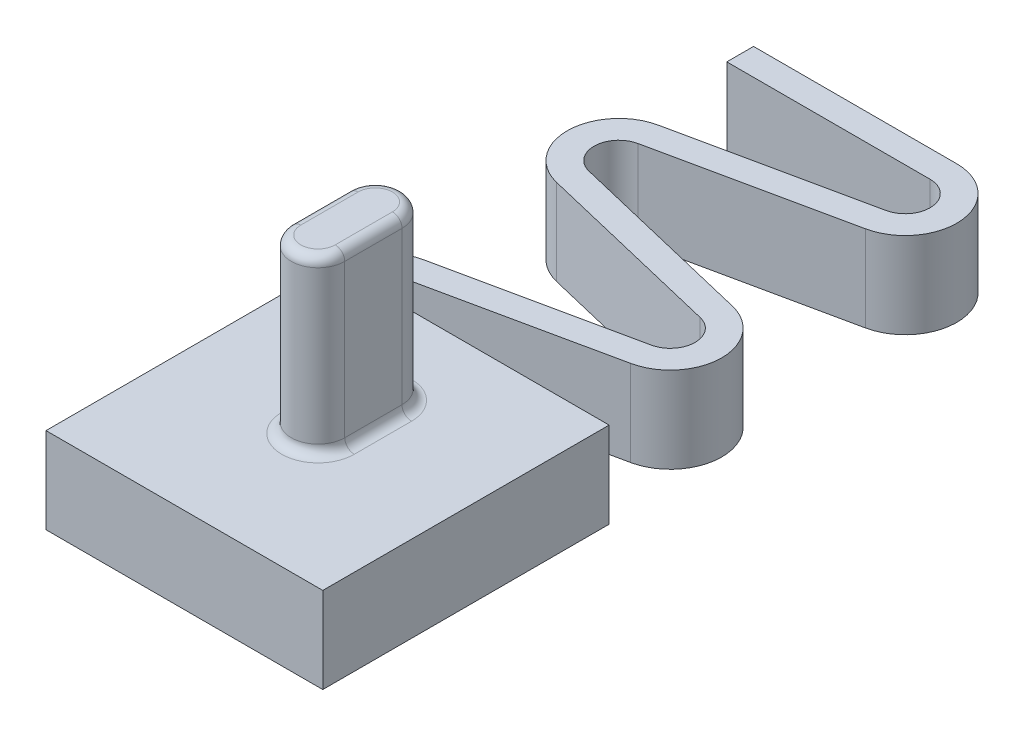
ISO-10303-21;
HEADER;
FILE_DESCRIPTION(('STEP AP214'),'2;1');
FILE_NAME('part.step','',(''),(''),'','','');
FILE_SCHEMA(('AUTOMOTIVE_DESIGN { 1 0 10303 214 1 1 1 1 }'));
ENDSEC;
DATA;
#1=APPLICATION_CONTEXT('core data for automotive mechanical design processes');
#2=APPLICATION_PROTOCOL_DEFINITION('international standard','automotive_design',2000,#1);
#3=PRODUCT_CONTEXT('',#1,'mechanical');
#4=PRODUCT('Part','Part','',(#3));
#5=PRODUCT_RELATED_PRODUCT_CATEGORY('part','',(#4));
#6=PRODUCT_DEFINITION_FORMATION('','',#4);
#7=PRODUCT_DEFINITION_CONTEXT('part definition',#1,'design');
#8=PRODUCT_DEFINITION('design','',#6,#7);
#9=PRODUCT_DEFINITION_SHAPE('','',#8);
#10=(LENGTH_UNIT() NAMED_UNIT(*) SI_UNIT(.MILLI.,.METRE.));
#11=(NAMED_UNIT(*) PLANE_ANGLE_UNIT() SI_UNIT($,.RADIAN.));
#12=(NAMED_UNIT(*) SI_UNIT($,.STERADIAN.) SOLID_ANGLE_UNIT());
#13=UNCERTAINTY_MEASURE_WITH_UNIT(LENGTH_MEASURE(1.E-05),#10,'distance_accuracy_value','');
#14=(GEOMETRIC_REPRESENTATION_CONTEXT(3) GLOBAL_UNCERTAINTY_ASSIGNED_CONTEXT((#13)) GLOBAL_UNIT_ASSIGNED_CONTEXT((#10,
#11,#12)) REPRESENTATION_CONTEXT('',''));
#15=CARTESIAN_POINT('',(0.,0.,0.));
#16=DIRECTION('',(0.,0.,1.));
#17=DIRECTION('',(1.,0.,0.));
#18=AXIS2_PLACEMENT_3D('',#15,#16,#17);
#19=CARTESIAN_POINT('',(0.,4.5,0.));
#20=DIRECTION('',(0.,-1.,0.));
#21=DIRECTION('',(0.,0.,-1.));
#22=AXIS2_PLACEMENT_3D('',#19,#20,#21);
#23=PLANE('',#22);
#24=DIRECTION('',(0.,0.,-1.));
#25=VECTOR('',#24,1.);
#26=CARTESIAN_POINT('',(1.9,4.5,0.500000000000003));
#27=LINE('',#26,#25);
#28=CARTESIAN_POINT('',(1.9,4.5,-2.5));
#29=VERTEX_POINT('',#28);
#30=CARTESIAN_POINT('',(1.9,4.5,0.500000000000003));
#31=VERTEX_POINT('',#30);
#32=EDGE_CURVE('E462',#29,#31,#27,.F.);
#33=ORIENTED_EDGE('',*,*,#32,.T.);
#34=CARTESIAN_POINT('',(0.,4.5,0.500000000000003));
#35=DIRECTION('',(0.,-1.,0.));
#36=DIRECTION('',(0.,0.,-1.));
#37=AXIS2_PLACEMENT_3D('',#34,#35,#36);
#38=CIRCLE('',#37,1.9);
#39=CARTESIAN_POINT('',(-1.9,4.5,0.500000000000003));
#40=VERTEX_POINT('',#39);
#41=EDGE_CURVE('E470',#31,#40,#38,.T.);
#42=ORIENTED_EDGE('',*,*,#41,.T.);
#43=DIRECTION('',(0.,0.,1.));
#44=VECTOR('',#43,1.);
#45=CARTESIAN_POINT('',(-1.9,4.5,-2.5));
#46=LINE('',#45,#44);
#47=CARTESIAN_POINT('',(-1.9,4.5,-2.5));
#48=VERTEX_POINT('',#47);
#49=EDGE_CURVE('E76',#40,#48,#46,.F.);
#50=ORIENTED_EDGE('',*,*,#49,.T.);
#51=CARTESIAN_POINT('',(0.,4.5,-2.5));
#52=DIRECTION('',(0.,-1.,0.));
#53=DIRECTION('',(0.,0.,-1.));
#54=AXIS2_PLACEMENT_3D('',#51,#52,#53);
#55=CIRCLE('',#54,1.9);
#56=EDGE_CURVE('E465',#48,#29,#55,.T.);
#57=ORIENTED_EDGE('',*,*,#56,.T.);
#58=EDGE_LOOP('',(#33,#42,#50,#57));
#59=FACE_BOUND('',#58,.T.);
#60=DIRECTION('',(-1.,0.,0.));
#61=VECTOR('',#60,1.);
#62=CARTESIAN_POINT('',(7.25,4.5,-7.5));
#63=LINE('',#62,#61);
#64=CARTESIAN_POINT('',(7.25,4.5,-7.5));
#65=VERTEX_POINT('',#64);
#66=CARTESIAN_POINT('',(-5.85,4.5,-7.5));
#67=VERTEX_POINT('',#66);
#68=EDGE_CURVE('E399',#65,#67,#63,.T.);
#69=ORIENTED_EDGE('',*,*,#68,.T.);
#70=CARTESIAN_POINT('',(-4.55000000000001,4.5,-7.5));
#71=DIRECTION('',(0.,1.,0.));
#72=DIRECTION('',(1.,0.,0.));
#73=AXIS2_PLACEMENT_3D('',#70,#71,#72);
#74=CIRCLE('',#73,1.3);
#75=CARTESIAN_POINT('',(-4.82028519806308,4.5,-8.77159188095395));
#76=VERTEX_POINT('',#75);
#77=EDGE_CURVE('E561',#67,#76,#74,.F.);
#78=ORIENTED_EDGE('',*,*,#77,.T.);
#79=DIRECTION('',(0.978147600733807,0.,-0.207911690817753));
#80=VECTOR('',#79,1.);
#81=CARTESIAN_POINT('',(-4.82028519806308,4.5,-8.77159188095395));
#82=LINE('',#81,#80);
#83=CARTESIAN_POINT('',(5.01136156520792,4.5,-10.861372912509));
#84=VERTEX_POINT('',#83);
#85=EDGE_CURVE('E557',#76,#84,#82,.T.);
#86=ORIENTED_EDGE('',*,*,#85,.T.);
#87=CARTESIAN_POINT('',(4.44999999999999,4.5,-13.5023714344902));
#88=DIRECTION('',(0.,1.,0.));
#89=DIRECTION('',(1.,0.,0.));
#90=AXIS2_PLACEMENT_3D('',#87,#88,#89);
#91=CIRCLE('',#90,2.7);
#92=CARTESIAN_POINT('',(5.07886156520793,4.5,-16.1281157350276));
#93=VERTEX_POINT('',#92);
#94=EDGE_CURVE('E553',#84,#93,#91,.T.);
#95=ORIENTED_EDGE('',*,*,#94,.T.);
#96=DIRECTION('',(-0.972497889087896,0.,-0.232911690817755));
#97=VECTOR('',#96,1.);
#98=CARTESIAN_POINT('',(5.07886156520793,4.5,-16.1281157350276));
#99=LINE('',#98,#97);
#100=CARTESIAN_POINT('',(-4.80278519806308,4.5,-18.4947543483575));
#101=VERTEX_POINT('',#100);
#102=EDGE_CURVE('E549',#93,#101,#99,.T.);
#103=ORIENTED_EDGE('',*,*,#102,.T.);
#104=CARTESIAN_POINT('',(-4.5,4.5,-19.7590016041718));
#105=DIRECTION('',(0.,1.,0.));
#106=DIRECTION('',(1.,0.,0.));
#107=AXIS2_PLACEMENT_3D('',#104,#105,#106);
#108=CIRCLE('',#107,1.3);
#109=CARTESIAN_POINT('',(-4.77028519806308,4.5,-21.0305934851257));
#110=VERTEX_POINT('',#109);
#111=EDGE_CURVE('E545',#101,#110,#108,.F.);
#112=ORIENTED_EDGE('',*,*,#111,.T.);
#113=DIRECTION('',(0.978147600733807,0.,-0.207911690817753));
#114=VECTOR('',#113,1.);
#115=CARTESIAN_POINT('',(-4.77028519806308,4.5,-21.0305934851257));
#116=LINE('',#115,#114);
#117=CARTESIAN_POINT('',(5.06136156520793,4.5,-23.1203745166807));
#118=VERTEX_POINT('',#117);
#119=EDGE_CURVE('E541',#110,#118,#116,.T.);
#120=ORIENTED_EDGE('',*,*,#119,.T.);
#121=CARTESIAN_POINT('',(4.5,4.5,-25.761373038662));
#122=DIRECTION('',(0.,1.,0.));
#123=DIRECTION('',(1.,0.,0.));
#124=AXIS2_PLACEMENT_3D('',#121,#122,#123);
#125=CIRCLE('',#124,2.7);
#126=CARTESIAN_POINT('',(4.5,4.5,-28.461373038662));
#127=VERTEX_POINT('',#126);
#128=EDGE_CURVE('E307',#118,#127,#125,.T.);
#129=ORIENTED_EDGE('',*,*,#128,.T.);
#130=DIRECTION('',(-1.,0.,0.));
#131=VECTOR('',#130,1.);
#132=CARTESIAN_POINT('',(4.5,4.5,-28.461373038662));
#133=LINE('',#132,#131);
#134=CARTESIAN_POINT('',(-6.14655289032117,4.5,-28.461373038662));
#135=VERTEX_POINT('',#134);
#136=EDGE_CURVE('E282',#127,#135,#133,.T.);
#137=ORIENTED_EDGE('',*,*,#136,.T.);
#138=DIRECTION('',(0.,0.,-1.));
#139=VECTOR('',#138,1.);
#140=CARTESIAN_POINT('',(-6.14655289032117,4.5,-27.061373038662));
#141=LINE('',#140,#139);
#142=CARTESIAN_POINT('',(-6.14655289032117,4.5,-27.061373038662));
#143=VERTEX_POINT('',#142);
#144=EDGE_CURVE('E257',#143,#135,#141,.T.);
#145=ORIENTED_EDGE('',*,*,#144,.F.);
#146=DIRECTION('',(-1.,0.,0.));
#147=VECTOR('',#146,1.);
#148=CARTESIAN_POINT('',(4.5,4.5,-27.061373038662));
#149=LINE('',#148,#147);
#150=CARTESIAN_POINT('',(4.5,4.5,-27.061373038662));
#151=VERTEX_POINT('',#150);
#152=EDGE_CURVE('E252',#151,#143,#149,.T.);
#153=ORIENTED_EDGE('',*,*,#152,.F.);
#154=CARTESIAN_POINT('',(4.5,4.5,-25.761373038662));
#155=DIRECTION('',(0.,1.,0.));
#156=DIRECTION('',(1.,0.,0.));
#157=AXIS2_PLACEMENT_3D('',#154,#155,#156);
#158=CIRCLE('',#157,1.3);
#159=CARTESIAN_POINT('',(4.77028519806308,4.5,-24.4897811577081));
#160=VERTEX_POINT('',#159);
#161=EDGE_CURVE('E381',#160,#151,#158,.T.);
#162=ORIENTED_EDGE('',*,*,#161,.F.);
#163=DIRECTION('',(0.978147600733807,0.,-0.207911690817753));
#164=VECTOR('',#163,1.);
#165=CARTESIAN_POINT('',(-5.06136156520793,4.5,-22.400000126153));
#166=LINE('',#165,#164);
#167=CARTESIAN_POINT('',(-5.06136156520793,4.5,-22.400000126153));
#168=VERTEX_POINT('',#167);
#169=EDGE_CURVE('E377',#168,#160,#166,.T.);
#170=ORIENTED_EDGE('',*,*,#169,.F.);
#171=CARTESIAN_POINT('',(-4.5,4.5,-19.7590016041718));
#172=DIRECTION('',(0.,1.,0.));
#173=DIRECTION('',(1.,0.,0.));
#174=AXIS2_PLACEMENT_3D('',#171,#172,#173);
#175=CIRCLE('',#174,2.7);
#176=CARTESIAN_POINT('',(-5.12886156520794,4.5,-17.1332573036344));
#177=VERTEX_POINT('',#176);
#178=EDGE_CURVE('E373',#177,#168,#175,.F.);
#179=ORIENTED_EDGE('',*,*,#178,.F.);
#180=DIRECTION('',(-0.972497889087896,0.,-0.232911690817755));
#181=VECTOR('',#180,1.);
#182=CARTESIAN_POINT('',(4.75278519806307,4.5,-14.7666186903045));
#183=LINE('',#182,#181);
#184=CARTESIAN_POINT('',(4.75278519806307,4.5,-14.7666186903045));
#185=VERTEX_POINT('',#184);
#186=EDGE_CURVE('E369',#185,#177,#183,.T.);
#187=ORIENTED_EDGE('',*,*,#186,.F.);
#188=CARTESIAN_POINT('',(4.44999999999999,4.5,-13.5023714344902));
#189=DIRECTION('',(0.,1.,0.));
#190=DIRECTION('',(1.,0.,0.));
#191=AXIS2_PLACEMENT_3D('',#188,#189,#190);
#192=CIRCLE('',#191,1.3);
#193=CARTESIAN_POINT('',(4.72028519806307,4.5,-12.2307795535363));
#194=VERTEX_POINT('',#193);
#195=EDGE_CURVE('E365',#194,#185,#192,.T.);
#196=ORIENTED_EDGE('',*,*,#195,.F.);
#197=DIRECTION('',(0.978147600733807,0.,-0.207911690817753));
#198=VECTOR('',#197,1.);
#199=CARTESIAN_POINT('',(-5.11136156520794,4.5,-10.1409985219813));
#200=LINE('',#199,#198);
#201=CARTESIAN_POINT('',(-5.11136156520794,4.5,-10.1409985219813));
#202=VERTEX_POINT('',#201);
#203=EDGE_CURVE('E361',#202,#194,#200,.T.);
#204=ORIENTED_EDGE('',*,*,#203,.F.);
#205=CARTESIAN_POINT('',(-4.55000000000001,4.5,-7.5));
#206=DIRECTION('',(0.,1.,0.));
#207=DIRECTION('',(1.,0.,0.));
#208=AXIS2_PLACEMENT_3D('',#205,#206,#207);
#209=CIRCLE('',#208,2.7);
#210=CARTESIAN_POINT('',(-7.25,4.5,-7.5));
#211=VERTEX_POINT('',#210);
#212=EDGE_CURVE('E357',#211,#202,#209,.F.);
#213=ORIENTED_EDGE('',*,*,#212,.F.);
#214=DIRECTION('',(0.,0.,1.));
#215=VECTOR('',#214,1.);
#216=CARTESIAN_POINT('',(-7.25,4.5,-7.5));
#217=LINE('',#216,#215);
#218=CARTESIAN_POINT('',(-7.25,4.5,7.5));
#219=VERTEX_POINT('',#218);
#220=EDGE_CURVE('E396',#211,#219,#217,.T.);
#221=ORIENTED_EDGE('',*,*,#220,.T.);
#222=DIRECTION('',(-1.,0.,0.));
#223=VECTOR('',#222,1.);
#224=CARTESIAN_POINT('',(7.25,4.5,7.5));
#225=LINE('',#224,#223);
#226=CARTESIAN_POINT('',(7.25,4.5,7.5));
#227=VERTEX_POINT('',#226);
#228=EDGE_CURVE('E391',#227,#219,#225,.T.);
#229=ORIENTED_EDGE('',*,*,#228,.F.);
#230=DIRECTION('',(0.,0.,1.));
#231=VECTOR('',#230,1.);
#232=CARTESIAN_POINT('',(7.25,4.5,-7.5));
#233=LINE('',#232,#231);
#234=EDGE_CURVE('E387',#65,#227,#233,.T.);
#235=ORIENTED_EDGE('',*,*,#234,.F.);
#236=EDGE_LOOP('',(#69,#78,#86,#95,#103,#112,#120,#129,#137,#145,#153,#162,#170,#179,#187,#196,
#204,#213,#221,#229,#235));
#237=FACE_BOUND('',#236,.T.);
#238=ADVANCED_FACE('F51',(#59,#237),#23,.F.);
#239=CARTESIAN_POINT('',(7.25,4.5,-7.5));
#240=DIRECTION('',(1.,0.,0.));
#241=DIRECTION('',(0.,0.,-1.));
#242=AXIS2_PLACEMENT_3D('',#239,#240,#241);
#243=PLANE('',#242);
#244=DIRECTION('',(0.,0.,1.));
#245=VECTOR('',#244,1.);
#246=CARTESIAN_POINT('',(7.25,0.,-7.5));
#247=LINE('',#246,#245);
#248=CARTESIAN_POINT('',(7.25,0.,-7.5));
#249=VERTEX_POINT('',#248);
#250=CARTESIAN_POINT('',(7.25,0.,7.5));
#251=VERTEX_POINT('',#250);
#252=EDGE_CURVE('E267',#249,#251,#247,.T.);
#253=ORIENTED_EDGE('',*,*,#252,.F.);
#254=DIRECTION('',(0.,-1.,0.));
#255=VECTOR('',#254,1.);
#256=CARTESIAN_POINT('',(7.25,4.5,-7.5));
#257=LINE('',#256,#255);
#258=EDGE_CURVE('E417',#65,#249,#257,.T.);
#259=ORIENTED_EDGE('',*,*,#258,.F.);
#260=ORIENTED_EDGE('',*,*,#234,.T.);
#261=DIRECTION('',(0.,-1.,0.));
#262=VECTOR('',#261,1.);
#263=CARTESIAN_POINT('',(7.25,4.5,7.5));
#264=LINE('',#263,#262);
#265=EDGE_CURVE('E403',#227,#251,#264,.T.);
#266=ORIENTED_EDGE('',*,*,#265,.T.);
#267=EDGE_LOOP('',(#253,#259,#260,#266));
#268=FACE_BOUND('',#267,.T.);
#269=ADVANCED_FACE('F632',(#268),#243,.T.);
#270=CARTESIAN_POINT('',(7.25,4.5,-7.5));
#271=DIRECTION('',(0.,0.,1.));
#272=DIRECTION('',(1.,0.,0.));
#273=AXIS2_PLACEMENT_3D('',#270,#271,#272);
#274=PLANE('',#273);
#275=DIRECTION('',(-1.,0.,0.));
#276=VECTOR('',#275,1.);
#277=CARTESIAN_POINT('',(7.25,0.,-7.5));
#278=LINE('',#277,#276);
#279=CARTESIAN_POINT('',(-5.85,0.,-7.5));
#280=VERTEX_POINT('',#279);
#281=EDGE_CURVE('E392',#249,#280,#278,.T.);
#282=ORIENTED_EDGE('',*,*,#281,.T.);
#283=DIRECTION('',(0.,1.,0.));
#284=VECTOR('',#283,1.);
#285=CARTESIAN_POINT('',(-5.85,-27.0955406565029,-7.5));
#286=LINE('',#285,#284);
#287=EDGE_CURVE('E353',#280,#67,#286,.T.);
#288=ORIENTED_EDGE('',*,*,#287,.T.);
#289=ORIENTED_EDGE('',*,*,#68,.F.);
#290=ORIENTED_EDGE('',*,*,#258,.T.);
#291=EDGE_LOOP('',(#282,#288,#289,#290));
#292=FACE_BOUND('',#291,.T.);
#293=ADVANCED_FACE('F628',(#292),#274,.F.);
#294=CARTESIAN_POINT('',(-7.25,4.5,-7.5));
#295=DIRECTION('',(1.,0.,0.));
#296=DIRECTION('',(0.,0.,-1.));
#297=AXIS2_PLACEMENT_3D('',#294,#295,#296);
#298=PLANE('',#297);
#299=DIRECTION('',(0.,0.,1.));
#300=VECTOR('',#299,1.);
#301=CARTESIAN_POINT('',(-7.25,0.,-7.5));
#302=LINE('',#301,#300);
#303=CARTESIAN_POINT('',(-7.25,0.,-7.5));
#304=VERTEX_POINT('',#303);
#305=CARTESIAN_POINT('',(-7.25,0.,7.5));
#306=VERTEX_POINT('',#305);
#307=EDGE_CURVE('E411',#304,#306,#302,.T.);
#308=ORIENTED_EDGE('',*,*,#307,.T.);
#309=DIRECTION('',(0.,-1.,0.));
#310=VECTOR('',#309,1.);
#311=CARTESIAN_POINT('',(-7.25,4.5,7.5));
#312=LINE('',#311,#310);
#313=EDGE_CURVE('E425',#219,#306,#312,.T.);
#314=ORIENTED_EDGE('',*,*,#313,.F.);
#315=ORIENTED_EDGE('',*,*,#220,.F.);
#316=DIRECTION('',(0.,-1.,0.));
#317=VECTOR('',#316,1.);
#318=CARTESIAN_POINT('',(-7.25,4.5,-7.5));
#319=LINE('',#318,#317);
#320=EDGE_CURVE('E421',#211,#304,#319,.T.);
#321=ORIENTED_EDGE('',*,*,#320,.T.);
#322=EDGE_LOOP('',(#308,#314,#315,#321));
#323=FACE_BOUND('',#322,.T.);
#324=ADVANCED_FACE('F640',(#323),#298,.F.);
#325=CARTESIAN_POINT('',(7.25,4.5,7.5));
#326=DIRECTION('',(0.,0.,1.));
#327=DIRECTION('',(1.,0.,0.));
#328=AXIS2_PLACEMENT_3D('',#325,#326,#327);
#329=PLANE('',#328);
#330=DIRECTION('',(-1.,0.,0.));
#331=VECTOR('',#330,1.);
#332=CARTESIAN_POINT('',(7.25,0.,7.5));
#333=LINE('',#332,#331);
#334=EDGE_CURVE('E407',#251,#306,#333,.T.);
#335=ORIENTED_EDGE('',*,*,#334,.F.);
#336=ORIENTED_EDGE('',*,*,#265,.F.);
#337=ORIENTED_EDGE('',*,*,#228,.T.);
#338=ORIENTED_EDGE('',*,*,#313,.T.);
#339=EDGE_LOOP('',(#335,#336,#337,#338));
#340=FACE_BOUND('',#339,.T.);
#341=ADVANCED_FACE('F635',(#340),#329,.T.);
#342=CARTESIAN_POINT('',(0.,0.,0.));
#343=DIRECTION('',(0.,-1.,0.));
#344=DIRECTION('',(0.,0.,-1.));
#345=AXIS2_PLACEMENT_3D('',#342,#343,#344);
#346=PLANE('',#345);
#347=ORIENTED_EDGE('',*,*,#307,.F.);
#348=CARTESIAN_POINT('',(-4.55000000000001,0.,-7.5));
#349=DIRECTION('',(0.,-1.,0.));
#350=DIRECTION('',(0.,0.,-1.));
#351=AXIS2_PLACEMENT_3D('',#348,#349,#350);
#352=CIRCLE('',#351,2.7);
#353=CARTESIAN_POINT('',(-5.11136156520794,0.,-10.1409985219813));
#354=VERTEX_POINT('',#353);
#355=EDGE_CURVE('E303',#304,#354,#352,.T.);
#356=ORIENTED_EDGE('',*,*,#355,.T.);
#357=DIRECTION('',(0.978147600733807,0.,-0.207911690817753));
#358=VECTOR('',#357,1.);
#359=CARTESIAN_POINT('',(-5.11136156520794,0.,-10.1409985219813));
#360=LINE('',#359,#358);
#361=CARTESIAN_POINT('',(4.72028519806307,0.,-12.2307795535363));
#362=VERTEX_POINT('',#361);
#363=EDGE_CURVE('E299',#354,#362,#360,.T.);
#364=ORIENTED_EDGE('',*,*,#363,.T.);
#365=CARTESIAN_POINT('',(4.44999999999999,0.,-13.5023714344902));
#366=DIRECTION('',(0.,-1.,0.));
#367=DIRECTION('',(0.,0.,-1.));
#368=AXIS2_PLACEMENT_3D('',#365,#366,#367);
#369=CIRCLE('',#368,1.3);
#370=CARTESIAN_POINT('',(4.75278519806307,0.,-14.7666186903045));
#371=VERTEX_POINT('',#370);
#372=EDGE_CURVE('E295',#362,#371,#369,.F.);
#373=ORIENTED_EDGE('',*,*,#372,.T.);
#374=DIRECTION('',(-0.972497889087896,0.,-0.232911690817755));
#375=VECTOR('',#374,1.);
#376=CARTESIAN_POINT('',(4.75278519806307,0.,-14.7666186903045));
#377=LINE('',#376,#375);
#378=CARTESIAN_POINT('',(-5.12886156520794,0.,-17.1332573036344));
#379=VERTEX_POINT('',#378);
#380=EDGE_CURVE('E291',#371,#379,#377,.T.);
#381=ORIENTED_EDGE('',*,*,#380,.T.);
#382=CARTESIAN_POINT('',(-4.5,0.,-19.7590016041718));
#383=DIRECTION('',(0.,-1.,0.));
#384=DIRECTION('',(0.,0.,-1.));
#385=AXIS2_PLACEMENT_3D('',#382,#383,#384);
#386=CIRCLE('',#385,2.7);
#387=CARTESIAN_POINT('',(-5.06136156520793,0.,-22.400000126153));
#388=VERTEX_POINT('',#387);
#389=EDGE_CURVE('E287',#379,#388,#386,.T.);
#390=ORIENTED_EDGE('',*,*,#389,.T.);
#391=DIRECTION('',(0.978147600733807,0.,-0.207911690817753));
#392=VECTOR('',#391,1.);
#393=CARTESIAN_POINT('',(-5.06136156520793,0.,-22.400000126153));
#394=LINE('',#393,#392);
#395=CARTESIAN_POINT('',(4.77028519806308,0.,-24.4897811577081));
#396=VERTEX_POINT('',#395);
#397=EDGE_CURVE('E279',#388,#396,#394,.T.);
#398=ORIENTED_EDGE('',*,*,#397,.T.);
#399=CARTESIAN_POINT('',(4.5,0.,-25.761373038662));
#400=DIRECTION('',(0.,-1.,0.));
#401=DIRECTION('',(0.,0.,-1.));
#402=AXIS2_PLACEMENT_3D('',#399,#400,#401);
#403=CIRCLE('',#402,1.3);
#404=CARTESIAN_POINT('',(4.5,0.,-27.061373038662));
#405=VERTEX_POINT('',#404);
#406=EDGE_CURVE('E273',#396,#405,#403,.F.);
#407=ORIENTED_EDGE('',*,*,#406,.T.);
#408=DIRECTION('',(-1.,0.,0.));
#409=VECTOR('',#408,1.);
#410=CARTESIAN_POINT('',(4.5,0.,-27.061373038662));
#411=LINE('',#410,#409);
#412=CARTESIAN_POINT('',(-6.14655289032117,0.,-27.061373038662));
#413=VERTEX_POINT('',#412);
#414=EDGE_CURVE('E249',#405,#413,#411,.T.);
#415=ORIENTED_EDGE('',*,*,#414,.T.);
#416=DIRECTION('',(0.,0.,-1.));
#417=VECTOR('',#416,1.);
#418=CARTESIAN_POINT('',(-6.14655289032117,0.,-27.061373038662));
#419=LINE('',#418,#417);
#420=CARTESIAN_POINT('',(-6.14655289032117,0.,-28.461373038662));
#421=VERTEX_POINT('',#420);
#422=EDGE_CURVE('E260',#413,#421,#419,.T.);
#423=ORIENTED_EDGE('',*,*,#422,.T.);
#424=DIRECTION('',(-1.,0.,0.));
#425=VECTOR('',#424,1.);
#426=CARTESIAN_POINT('',(4.5,0.,-28.461373038662));
#427=LINE('',#426,#425);
#428=CARTESIAN_POINT('',(4.5,0.,-28.461373038662));
#429=VERTEX_POINT('',#428);
#430=EDGE_CURVE('E336',#429,#421,#427,.T.);
#431=ORIENTED_EDGE('',*,*,#430,.F.);
#432=CARTESIAN_POINT('',(4.5,0.,-25.761373038662));
#433=DIRECTION('',(0.,-1.,0.));
#434=DIRECTION('',(0.,0.,-1.));
#435=AXIS2_PLACEMENT_3D('',#432,#433,#434);
#436=CIRCLE('',#435,2.7);
#437=CARTESIAN_POINT('',(5.06136156520793,0.,-23.1203745166807));
#438=VERTEX_POINT('',#437);
#439=EDGE_CURVE('E333',#438,#429,#436,.F.);
#440=ORIENTED_EDGE('',*,*,#439,.F.);
#441=DIRECTION('',(0.978147600733807,0.,-0.207911690817753));
#442=VECTOR('',#441,1.);
#443=CARTESIAN_POINT('',(-4.77028519806308,0.,-21.0305934851257));
#444=LINE('',#443,#442);
#445=CARTESIAN_POINT('',(-4.77028519806308,0.,-21.0305934851257));
#446=VERTEX_POINT('',#445);
#447=EDGE_CURVE('E329',#446,#438,#444,.T.);
#448=ORIENTED_EDGE('',*,*,#447,.F.);
#449=CARTESIAN_POINT('',(-4.5,0.,-19.7590016041718));
#450=DIRECTION('',(0.,-1.,0.));
#451=DIRECTION('',(0.,0.,-1.));
#452=AXIS2_PLACEMENT_3D('',#449,#450,#451);
#453=CIRCLE('',#452,1.3);
#454=CARTESIAN_POINT('',(-4.80278519806308,0.,-18.4947543483575));
#455=VERTEX_POINT('',#454);
#456=EDGE_CURVE('E325',#455,#446,#453,.T.);
#457=ORIENTED_EDGE('',*,*,#456,.F.);
#458=DIRECTION('',(-0.972497889087896,0.,-0.232911690817755));
#459=VECTOR('',#458,1.);
#460=CARTESIAN_POINT('',(5.07886156520793,0.,-16.1281157350276));
#461=LINE('',#460,#459);
#462=CARTESIAN_POINT('',(5.07886156520793,0.,-16.1281157350276));
#463=VERTEX_POINT('',#462);
#464=EDGE_CURVE('E321',#463,#455,#461,.T.);
#465=ORIENTED_EDGE('',*,*,#464,.F.);
#466=CARTESIAN_POINT('',(4.44999999999999,0.,-13.5023714344902));
#467=DIRECTION('',(0.,-1.,0.));
#468=DIRECTION('',(0.,0.,-1.));
#469=AXIS2_PLACEMENT_3D('',#466,#467,#468);
#470=CIRCLE('',#469,2.7);
#471=CARTESIAN_POINT('',(5.01136156520792,0.,-10.861372912509));
#472=VERTEX_POINT('',#471);
#473=EDGE_CURVE('E317',#472,#463,#470,.F.);
#474=ORIENTED_EDGE('',*,*,#473,.F.);
#475=DIRECTION('',(0.978147600733807,0.,-0.207911690817753));
#476=VECTOR('',#475,1.);
#477=CARTESIAN_POINT('',(-4.82028519806308,0.,-8.77159188095395));
#478=LINE('',#477,#476);
#479=CARTESIAN_POINT('',(-4.82028519806308,0.,-8.77159188095395));
#480=VERTEX_POINT('',#479);
#481=EDGE_CURVE('E313',#480,#472,#478,.T.);
#482=ORIENTED_EDGE('',*,*,#481,.F.);
#483=CARTESIAN_POINT('',(-4.55000000000001,0.,-7.5));
#484=DIRECTION('',(0.,-1.,0.));
#485=DIRECTION('',(0.,0.,-1.));
#486=AXIS2_PLACEMENT_3D('',#483,#484,#485);
#487=CIRCLE('',#486,1.3);
#488=EDGE_CURVE('E308',#280,#480,#487,.T.);
#489=ORIENTED_EDGE('',*,*,#488,.F.);
#490=ORIENTED_EDGE('',*,*,#281,.F.);
#491=ORIENTED_EDGE('',*,*,#252,.T.);
#492=ORIENTED_EDGE('',*,*,#334,.T.);
#493=EDGE_LOOP('',(#347,#356,#364,#373,#381,#390,#398,#407,#415,#423,#431,#440,#448,#457,#465,
#474,#482,#489,#490,#491,#492));
#494=FACE_BOUND('',#493,.T.);
#495=ADVANCED_FACE('F271',(#494),#346,.T.);
#496=CARTESIAN_POINT('',(4.5,-27.0955406565029,-28.461373038662));
#497=DIRECTION('',(0.,0.,-1.));
#498=DIRECTION('',(-1.,0.,0.));
#499=AXIS2_PLACEMENT_3D('',#496,#497,#498);
#500=PLANE('',#499);
#501=DIRECTION('',(0.,1.,0.));
#502=VECTOR('',#501,1.);
#503=CARTESIAN_POINT('',(4.5,-27.0955406565029,-28.461373038662));
#504=LINE('',#503,#502);
#505=EDGE_CURVE('E332',#429,#127,#504,.T.);
#506=ORIENTED_EDGE('',*,*,#505,.F.);
#507=ORIENTED_EDGE('',*,*,#430,.T.);
#508=DIRECTION('',(0.,1.,0.));
#509=VECTOR('',#508,1.);
#510=CARTESIAN_POINT('',(-6.14655289032117,-27.0955406565029,-28.461373038662));
#511=LINE('',#510,#509);
#512=EDGE_CURVE('E262',#421,#135,#511,.T.);
#513=ORIENTED_EDGE('',*,*,#512,.T.);
#514=ORIENTED_EDGE('',*,*,#136,.F.);
#515=EDGE_LOOP('',(#506,#507,#513,#514));
#516=FACE_BOUND('',#515,.T.);
#517=ADVANCED_FACE('F593',(#516),#500,.T.);
#518=CARTESIAN_POINT('',(4.5,-27.0955406565029,-25.761373038662));
#519=DIRECTION('',(0.,1.,0.));
#520=DIRECTION('',(0.,0.,1.));
#521=AXIS2_PLACEMENT_3D('',#518,#519,#520);
#522=CYLINDRICAL_SURFACE('',#521,2.7);
#523=DIRECTION('',(0.,1.,0.));
#524=VECTOR('',#523,1.);
#525=CARTESIAN_POINT('',(5.06136156520793,-27.0955406565029,-23.1203745166807));
#526=LINE('',#525,#524);
#527=EDGE_CURVE('E328',#438,#118,#526,.T.);
#528=ORIENTED_EDGE('',*,*,#527,.F.);
#529=ORIENTED_EDGE('',*,*,#439,.T.);
#530=ORIENTED_EDGE('',*,*,#505,.T.);
#531=ORIENTED_EDGE('',*,*,#128,.F.);
#532=EDGE_LOOP('',(#528,#529,#530,#531));
#533=FACE_BOUND('',#532,.T.);
#534=ADVANCED_FACE('F599',(#533),#522,.T.);
#535=CARTESIAN_POINT('',(-4.77028519806308,-27.0955406565029,-21.0305934851257));
#536=DIRECTION('',(0.207911690817753,0.,0.978147600733807));
#537=DIRECTION('',(0.978147600733807,0.,-0.207911690817753));
#538=AXIS2_PLACEMENT_3D('',#535,#536,#537);
#539=PLANE('',#538);
#540=DIRECTION('',(0.,1.,0.));
#541=VECTOR('',#540,1.);
#542=CARTESIAN_POINT('',(-4.77028519806308,-27.0955406565029,-21.0305934851257));
#543=LINE('',#542,#541);
#544=EDGE_CURVE('E324',#446,#110,#543,.T.);
#545=ORIENTED_EDGE('',*,*,#544,.F.);
#546=ORIENTED_EDGE('',*,*,#447,.T.);
#547=ORIENTED_EDGE('',*,*,#527,.T.);
#548=ORIENTED_EDGE('',*,*,#119,.F.);
#549=EDGE_LOOP('',(#545,#546,#547,#548));
#550=FACE_BOUND('',#549,.T.);
#551=ADVANCED_FACE('F603',(#550),#539,.T.);
#552=CARTESIAN_POINT('',(-4.5,-27.0955406565029,-19.7590016041718));
#553=DIRECTION('',(0.,1.,0.));
#554=DIRECTION('',(0.,0.,1.));
#555=AXIS2_PLACEMENT_3D('',#552,#553,#554);
#556=CYLINDRICAL_SURFACE('',#555,1.3);
#557=DIRECTION('',(0.,1.,0.));
#558=VECTOR('',#557,1.);
#559=CARTESIAN_POINT('',(-4.80278519806308,-27.0955406565029,-18.4947543483575));
#560=LINE('',#559,#558);
#561=EDGE_CURVE('E320',#455,#101,#560,.T.);
#562=ORIENTED_EDGE('',*,*,#561,.F.);
#563=ORIENTED_EDGE('',*,*,#456,.T.);
#564=ORIENTED_EDGE('',*,*,#544,.T.);
#565=ORIENTED_EDGE('',*,*,#111,.F.);
#566=EDGE_LOOP('',(#562,#563,#564,#565));
#567=FACE_BOUND('',#566,.T.);
#568=ADVANCED_FACE('F608',(#567),#556,.F.);
#569=CARTESIAN_POINT('',(5.07886156520793,-27.0955406565029,-16.1281157350276));
#570=DIRECTION('',(0.232911690817755,0.,-0.972497889087896));
#571=DIRECTION('',(-0.972497889087896,0.,-0.232911690817755));
#572=AXIS2_PLACEMENT_3D('',#569,#570,#571);
#573=PLANE('',#572);
#574=DIRECTION('',(0.,1.,0.));
#575=VECTOR('',#574,1.);
#576=CARTESIAN_POINT('',(5.07886156520793,-27.0955406565029,-16.1281157350276));
#577=LINE('',#576,#575);
#578=EDGE_CURVE('E316',#463,#93,#577,.T.);
#579=ORIENTED_EDGE('',*,*,#578,.F.);
#580=ORIENTED_EDGE('',*,*,#464,.T.);
#581=ORIENTED_EDGE('',*,*,#561,.T.);
#582=ORIENTED_EDGE('',*,*,#102,.F.);
#583=EDGE_LOOP('',(#579,#580,#581,#582));
#584=FACE_BOUND('',#583,.T.);
#585=ADVANCED_FACE('F614',(#584),#573,.T.);
#586=CARTESIAN_POINT('',(4.44999999999999,-27.0955406565029,-13.5023714344902));
#587=DIRECTION('',(0.,1.,0.));
#588=DIRECTION('',(0.,0.,1.));
#589=AXIS2_PLACEMENT_3D('',#586,#587,#588);
#590=CYLINDRICAL_SURFACE('',#589,2.7);
#591=DIRECTION('',(0.,1.,0.));
#592=VECTOR('',#591,1.);
#593=CARTESIAN_POINT('',(5.01136156520792,-27.0955406565029,-10.861372912509));
#594=LINE('',#593,#592);
#595=EDGE_CURVE('E312',#472,#84,#594,.T.);
#596=ORIENTED_EDGE('',*,*,#595,.F.);
#597=ORIENTED_EDGE('',*,*,#473,.T.);
#598=ORIENTED_EDGE('',*,*,#578,.T.);
#599=ORIENTED_EDGE('',*,*,#94,.F.);
#600=EDGE_LOOP('',(#596,#597,#598,#599));
#601=FACE_BOUND('',#600,.T.);
#602=ADVANCED_FACE('F618',(#601),#590,.T.);
#603=CARTESIAN_POINT('',(-4.82028519806308,-27.0955406565029,-8.77159188095395));
#604=DIRECTION('',(0.207911690817753,0.,0.978147600733807));
#605=DIRECTION('',(0.978147600733807,0.,-0.207911690817753));
#606=AXIS2_PLACEMENT_3D('',#603,#604,#605);
#607=PLANE('',#606);
#608=DIRECTION('',(0.,1.,0.));
#609=VECTOR('',#608,1.);
#610=CARTESIAN_POINT('',(-4.82028519806308,-27.0955406565029,-8.77159188095395));
#611=LINE('',#610,#609);
#612=EDGE_CURVE('E311',#480,#76,#611,.T.);
#613=ORIENTED_EDGE('',*,*,#612,.F.);
#614=ORIENTED_EDGE('',*,*,#481,.T.);
#615=ORIENTED_EDGE('',*,*,#595,.T.);
#616=ORIENTED_EDGE('',*,*,#85,.F.);
#617=EDGE_LOOP('',(#613,#614,#615,#616));
#618=FACE_BOUND('',#617,.T.);
#619=ADVANCED_FACE('F622',(#618),#607,.T.);
#620=CARTESIAN_POINT('',(-4.55000000000001,-27.0955406565029,-7.5));
#621=DIRECTION('',(0.,1.,0.));
#622=DIRECTION('',(0.,0.,1.));
#623=AXIS2_PLACEMENT_3D('',#620,#621,#622);
#624=CYLINDRICAL_SURFACE('',#623,1.3);
#625=ORIENTED_EDGE('',*,*,#287,.F.);
#626=ORIENTED_EDGE('',*,*,#488,.T.);
#627=ORIENTED_EDGE('',*,*,#612,.T.);
#628=ORIENTED_EDGE('',*,*,#77,.F.);
#629=EDGE_LOOP('',(#625,#626,#627,#628));
#630=FACE_BOUND('',#629,.T.);
#631=ADVANCED_FACE('F805',(#630),#624,.F.);
#632=CARTESIAN_POINT('',(-4.55000000000001,-27.0955406565029,-7.5));
#633=DIRECTION('',(0.,1.,0.));
#634=DIRECTION('',(0.,0.,1.));
#635=AXIS2_PLACEMENT_3D('',#632,#633,#634);
#636=CYLINDRICAL_SURFACE('',#635,2.7);
#637=ORIENTED_EDGE('',*,*,#355,.F.);
#638=ORIENTED_EDGE('',*,*,#320,.F.);
#639=ORIENTED_EDGE('',*,*,#212,.T.);
#640=DIRECTION('',(0.,1.,0.));
#641=VECTOR('',#640,1.);
#642=CARTESIAN_POINT('',(-5.11136156520794,-27.0955406565029,-10.1409985219813));
#643=LINE('',#642,#641);
#644=EDGE_CURVE('E358',#354,#202,#643,.T.);
#645=ORIENTED_EDGE('',*,*,#644,.F.);
#646=EDGE_LOOP('',(#637,#638,#639,#645));
#647=FACE_BOUND('',#646,.T.);
#648=ADVANCED_FACE('F643',(#647),#636,.T.);
#649=CARTESIAN_POINT('',(-5.11136156520794,-27.0955406565029,-10.1409985219813));
#650=DIRECTION('',(0.207911690817753,0.,0.978147600733807));
#651=DIRECTION('',(0.978147600733807,0.,-0.207911690817753));
#652=AXIS2_PLACEMENT_3D('',#649,#650,#651);
#653=PLANE('',#652);
#654=ORIENTED_EDGE('',*,*,#363,.F.);
#655=ORIENTED_EDGE('',*,*,#644,.T.);
#656=ORIENTED_EDGE('',*,*,#203,.T.);
#657=DIRECTION('',(0.,1.,0.));
#658=VECTOR('',#657,1.);
#659=CARTESIAN_POINT('',(4.72028519806307,-27.0955406565029,-12.2307795535363));
#660=LINE('',#659,#658);
#661=EDGE_CURVE('E362',#362,#194,#660,.T.);
#662=ORIENTED_EDGE('',*,*,#661,.F.);
#663=EDGE_LOOP('',(#654,#655,#656,#662));
#664=FACE_BOUND('',#663,.T.);
#665=ADVANCED_FACE('F650',(#664),#653,.F.);
#666=CARTESIAN_POINT('',(4.44999999999999,-27.0955406565029,-13.5023714344902));
#667=DIRECTION('',(0.,1.,0.));
#668=DIRECTION('',(0.,0.,1.));
#669=AXIS2_PLACEMENT_3D('',#666,#667,#668);
#670=CYLINDRICAL_SURFACE('',#669,1.3);
#671=ORIENTED_EDGE('',*,*,#372,.F.);
#672=ORIENTED_EDGE('',*,*,#661,.T.);
#673=ORIENTED_EDGE('',*,*,#195,.T.);
#674=DIRECTION('',(0.,1.,0.));
#675=VECTOR('',#674,1.);
#676=CARTESIAN_POINT('',(4.75278519806307,-27.0955406565029,-14.7666186903045));
#677=LINE('',#676,#675);
#678=EDGE_CURVE('E366',#371,#185,#677,.T.);
#679=ORIENTED_EDGE('',*,*,#678,.F.);
#680=EDGE_LOOP('',(#671,#672,#673,#679));
#681=FACE_BOUND('',#680,.T.);
#682=ADVANCED_FACE('F653',(#681),#670,.F.);
#683=CARTESIAN_POINT('',(4.75278519806307,-27.0955406565029,-14.7666186903045));
#684=DIRECTION('',(0.232911690817755,0.,-0.972497889087896));
#685=DIRECTION('',(-0.972497889087896,0.,-0.232911690817755));
#686=AXIS2_PLACEMENT_3D('',#683,#684,#685);
#687=PLANE('',#686);
#688=ORIENTED_EDGE('',*,*,#380,.F.);
#689=ORIENTED_EDGE('',*,*,#678,.T.);
#690=ORIENTED_EDGE('',*,*,#186,.T.);
#691=DIRECTION('',(0.,1.,0.));
#692=VECTOR('',#691,1.);
#693=CARTESIAN_POINT('',(-5.12886156520794,-27.0955406565029,-17.1332573036344));
#694=LINE('',#693,#692);
#695=EDGE_CURVE('E370',#379,#177,#694,.T.);
#696=ORIENTED_EDGE('',*,*,#695,.F.);
#697=EDGE_LOOP('',(#688,#689,#690,#696));
#698=FACE_BOUND('',#697,.T.);
#699=ADVANCED_FACE('F655',(#698),#687,.F.);
#700=CARTESIAN_POINT('',(-4.5,-27.0955406565029,-19.7590016041718));
#701=DIRECTION('',(0.,1.,0.));
#702=DIRECTION('',(0.,0.,1.));
#703=AXIS2_PLACEMENT_3D('',#700,#701,#702);
#704=CYLINDRICAL_SURFACE('',#703,2.7);
#705=ORIENTED_EDGE('',*,*,#389,.F.);
#706=ORIENTED_EDGE('',*,*,#695,.T.);
#707=ORIENTED_EDGE('',*,*,#178,.T.);
#708=DIRECTION('',(0.,1.,0.));
#709=VECTOR('',#708,1.);
#710=CARTESIAN_POINT('',(-5.06136156520793,-27.0955406565029,-22.400000126153));
#711=LINE('',#710,#709);
#712=EDGE_CURVE('E374',#388,#168,#711,.T.);
#713=ORIENTED_EDGE('',*,*,#712,.F.);
#714=EDGE_LOOP('',(#705,#706,#707,#713));
#715=FACE_BOUND('',#714,.T.);
#716=ADVANCED_FACE('F659',(#715),#704,.T.);
#717=CARTESIAN_POINT('',(-5.06136156520793,-27.0955406565029,-22.400000126153));
#718=DIRECTION('',(0.207911690817753,0.,0.978147600733807));
#719=DIRECTION('',(0.978147600733807,0.,-0.207911690817753));
#720=AXIS2_PLACEMENT_3D('',#717,#718,#719);
#721=PLANE('',#720);
#722=ORIENTED_EDGE('',*,*,#397,.F.);
#723=ORIENTED_EDGE('',*,*,#712,.T.);
#724=ORIENTED_EDGE('',*,*,#169,.T.);
#725=DIRECTION('',(0.,1.,0.));
#726=VECTOR('',#725,1.);
#727=CARTESIAN_POINT('',(4.77028519806308,-27.0955406565029,-24.4897811577081));
#728=LINE('',#727,#726);
#729=EDGE_CURVE('E378',#396,#160,#728,.T.);
#730=ORIENTED_EDGE('',*,*,#729,.F.);
#731=EDGE_LOOP('',(#722,#723,#724,#730));
#732=FACE_BOUND('',#731,.T.);
#733=ADVANCED_FACE('F664',(#732),#721,.F.);
#734=CARTESIAN_POINT('',(4.5,-27.0955406565029,-25.761373038662));
#735=DIRECTION('',(0.,1.,0.));
#736=DIRECTION('',(0.,0.,1.));
#737=AXIS2_PLACEMENT_3D('',#734,#735,#736);
#738=CYLINDRICAL_SURFACE('',#737,1.3);
#739=ORIENTED_EDGE('',*,*,#406,.F.);
#740=ORIENTED_EDGE('',*,*,#729,.T.);
#741=ORIENTED_EDGE('',*,*,#161,.T.);
#742=DIRECTION('',(0.,1.,0.));
#743=VECTOR('',#742,1.);
#744=CARTESIAN_POINT('',(4.5,-27.0955406565029,-27.061373038662));
#745=LINE('',#744,#743);
#746=EDGE_CURVE('E382',#405,#151,#745,.T.);
#747=ORIENTED_EDGE('',*,*,#746,.F.);
#748=EDGE_LOOP('',(#739,#740,#741,#747));
#749=FACE_BOUND('',#748,.T.);
#750=ADVANCED_FACE('F667',(#749),#738,.F.);
#751=CARTESIAN_POINT('',(4.5,-27.0955406565029,-27.061373038662));
#752=DIRECTION('',(0.,0.,-1.));
#753=DIRECTION('',(-1.,0.,0.));
#754=AXIS2_PLACEMENT_3D('',#751,#752,#753);
#755=PLANE('',#754);
#756=ORIENTED_EDGE('',*,*,#414,.F.);
#757=ORIENTED_EDGE('',*,*,#746,.T.);
#758=ORIENTED_EDGE('',*,*,#152,.T.);
#759=DIRECTION('',(0.,1.,0.));
#760=VECTOR('',#759,1.);
#761=CARTESIAN_POINT('',(-6.14655289032117,-27.0955406565029,-27.061373038662));
#762=LINE('',#761,#760);
#763=EDGE_CURVE('E245',#413,#143,#762,.T.);
#764=ORIENTED_EDGE('',*,*,#763,.F.);
#765=EDGE_LOOP('',(#756,#757,#758,#764));
#766=FACE_BOUND('',#765,.T.);
#767=ADVANCED_FACE('F247',(#766),#755,.F.);
#768=CARTESIAN_POINT('',(-6.14655289032117,-27.0955406565029,-27.061373038662));
#769=DIRECTION('',(1.,0.,0.));
#770=DIRECTION('',(0.,0.,-1.));
#771=AXIS2_PLACEMENT_3D('',#768,#769,#770);
#772=PLANE('',#771);
#773=ORIENTED_EDGE('',*,*,#422,.F.);
#774=ORIENTED_EDGE('',*,*,#763,.T.);
#775=ORIENTED_EDGE('',*,*,#144,.T.);
#776=ORIENTED_EDGE('',*,*,#512,.F.);
#777=EDGE_LOOP('',(#773,#774,#775,#776));
#778=FACE_BOUND('',#777,.T.);
#779=ADVANCED_FACE('F261',(#778),#772,.F.);
#780=CARTESIAN_POINT('',(0.,13.5,-2.5));
#781=DIRECTION('',(0.,-1.,0.));
#782=DIRECTION('',(0.,0.,-1.));
#783=AXIS2_PLACEMENT_3D('',#780,#781,#782);
#784=CYLINDRICAL_SURFACE('',#783,1.4);
#785=DIRECTION('',(0.,-1.,0.));
#786=VECTOR('',#785,1.);
#787=CARTESIAN_POINT('',(-1.4,13.5,-2.5));
#788=LINE('',#787,#786);
#789=CARTESIAN_POINT('',(-1.4,13.,-2.5));
#790=VERTEX_POINT('',#789);
#791=CARTESIAN_POINT('',(-1.4,5.,-2.5));
#792=VERTEX_POINT('',#791);
#793=EDGE_CURVE('E338',#790,#792,#788,.T.);
#794=ORIENTED_EDGE('',*,*,#793,.F.);
#795=CARTESIAN_POINT('',(0.,13.,-2.5));
#796=DIRECTION('',(0.,1.,0.));
#797=DIRECTION('',(0.,0.,1.));
#798=AXIS2_PLACEMENT_3D('',#795,#796,#797);
#799=CIRCLE('',#798,1.4);
#800=CARTESIAN_POINT('',(1.4,13.,-2.5));
#801=VERTEX_POINT('',#800);
#802=EDGE_CURVE('E459',#790,#801,#799,.F.);
#803=ORIENTED_EDGE('',*,*,#802,.T.);
#804=DIRECTION('',(0.,-1.,0.));
#805=VECTOR('',#804,1.);
#806=CARTESIAN_POINT('',(1.4,13.5,-2.5));
#807=LINE('',#806,#805);
#808=CARTESIAN_POINT('',(1.4,5.,-2.5));
#809=VERTEX_POINT('',#808);
#810=EDGE_CURVE('E489',#801,#809,#807,.T.);
#811=ORIENTED_EDGE('',*,*,#810,.T.);
#812=CARTESIAN_POINT('',(0.,5.,-2.5));
#813=DIRECTION('',(0.,-1.,0.));
#814=DIRECTION('',(0.,0.,-1.));
#815=AXIS2_PLACEMENT_3D('',#812,#813,#814);
#816=CIRCLE('',#815,1.4);
#817=EDGE_CURVE('E456',#809,#792,#816,.F.);
#818=ORIENTED_EDGE('',*,*,#817,.T.);
#819=EDGE_LOOP('',(#794,#803,#811,#818));
#820=FACE_BOUND('',#819,.T.);
#821=ADVANCED_FACE('F753',(#820),#784,.T.);
#822=CARTESIAN_POINT('',(-1.4,13.5,-2.5));
#823=DIRECTION('',(1.,0.,0.));
#824=DIRECTION('',(0.,0.,-1.));
#825=AXIS2_PLACEMENT_3D('',#822,#823,#824);
#826=PLANE('',#825);
#827=DIRECTION('',(0.,-1.,0.));
#828=VECTOR('',#827,1.);
#829=CARTESIAN_POINT('',(-1.4,13.5,0.500000000000003));
#830=LINE('',#829,#828);
#831=CARTESIAN_POINT('',(-1.4,13.,0.500000000000003));
#832=VERTEX_POINT('',#831);
#833=CARTESIAN_POINT('',(-1.4,5.,0.500000000000003));
#834=VERTEX_POINT('',#833);
#835=EDGE_CURVE('E525',#832,#834,#830,.T.);
#836=ORIENTED_EDGE('',*,*,#835,.F.);
#837=DIRECTION('',(0.,0.,1.));
#838=VECTOR('',#837,1.);
#839=CARTESIAN_POINT('',(-1.4,13.,-2.5));
#840=LINE('',#839,#838);
#841=EDGE_CURVE('E453',#832,#790,#840,.F.);
#842=ORIENTED_EDGE('',*,*,#841,.T.);
#843=ORIENTED_EDGE('',*,*,#793,.T.);
#844=DIRECTION('',(0.,0.,1.));
#845=VECTOR('',#844,1.);
#846=CARTESIAN_POINT('',(-1.4,5.,0.500000000000003));
#847=LINE('',#846,#845);
#848=EDGE_CURVE('E450',#792,#834,#847,.T.);
#849=ORIENTED_EDGE('',*,*,#848,.T.);
#850=EDGE_LOOP('',(#836,#842,#843,#849));
#851=FACE_BOUND('',#850,.T.);
#852=ADVANCED_FACE('F747',(#851),#826,.F.);
#853=CARTESIAN_POINT('',(0.,13.5,0.500000000000003));
#854=DIRECTION('',(0.,-1.,0.));
#855=DIRECTION('',(0.,0.,-1.));
#856=AXIS2_PLACEMENT_3D('',#853,#854,#855);
#857=CYLINDRICAL_SURFACE('',#856,1.4);
#858=DIRECTION('',(0.,-1.,0.));
#859=VECTOR('',#858,1.);
#860=CARTESIAN_POINT('',(1.4,13.5,0.500000000000003));
#861=LINE('',#860,#859);
#862=CARTESIAN_POINT('',(1.4,13.,0.500000000000003));
#863=VERTEX_POINT('',#862);
#864=CARTESIAN_POINT('',(1.4,5.,0.500000000000003));
#865=VERTEX_POINT('',#864);
#866=EDGE_CURVE('E522',#863,#865,#861,.T.);
#867=ORIENTED_EDGE('',*,*,#866,.F.);
#868=CARTESIAN_POINT('',(0.,13.,0.500000000000003));
#869=DIRECTION('',(0.,1.,0.));
#870=DIRECTION('',(0.,0.,1.));
#871=AXIS2_PLACEMENT_3D('',#868,#869,#870);
#872=CIRCLE('',#871,1.4);
#873=EDGE_CURVE('E446',#863,#832,#872,.F.);
#874=ORIENTED_EDGE('',*,*,#873,.T.);
#875=ORIENTED_EDGE('',*,*,#835,.T.);
#876=CARTESIAN_POINT('',(0.,5.,0.500000000000003));
#877=DIRECTION('',(0.,-1.,0.));
#878=DIRECTION('',(0.,0.,-1.));
#879=AXIS2_PLACEMENT_3D('',#876,#877,#878);
#880=CIRCLE('',#879,1.4);
#881=EDGE_CURVE('E442',#834,#865,#880,.F.);
#882=ORIENTED_EDGE('',*,*,#881,.T.);
#883=EDGE_LOOP('',(#867,#874,#875,#882));
#884=FACE_BOUND('',#883,.T.);
#885=ADVANCED_FACE('F521',(#884),#857,.T.);
#886=CARTESIAN_POINT('',(1.4,13.5,-2.5));
#887=DIRECTION('',(-1.,0.,0.));
#888=DIRECTION('',(0.,0.,1.));
#889=AXIS2_PLACEMENT_3D('',#886,#887,#888);
#890=PLANE('',#889);
#891=ORIENTED_EDGE('',*,*,#810,.F.);
#892=DIRECTION('',(0.,0.,-1.));
#893=VECTOR('',#892,1.);
#894=CARTESIAN_POINT('',(1.4,13.,0.500000000000003));
#895=LINE('',#894,#893);
#896=EDGE_CURVE('E11',#801,#863,#895,.F.);
#897=ORIENTED_EDGE('',*,*,#896,.T.);
#898=ORIENTED_EDGE('',*,*,#866,.T.);
#899=DIRECTION('',(0.,0.,-1.));
#900=VECTOR('',#899,1.);
#901=CARTESIAN_POINT('',(1.4,5.,-2.5));
#902=LINE('',#901,#900);
#903=EDGE_CURVE('E61',#865,#809,#902,.T.);
#904=ORIENTED_EDGE('',*,*,#903,.T.);
#905=EDGE_LOOP('',(#891,#897,#898,#904));
#906=FACE_BOUND('',#905,.T.);
#907=ADVANCED_FACE('F526',(#906),#890,.F.);
#908=CARTESIAN_POINT('',(0.,13.5,-2.5));
#909=DIRECTION('',(0.,1.,0.));
#910=DIRECTION('',(0.,0.,1.));
#911=AXIS2_PLACEMENT_3D('',#908,#909,#910);
#912=PLANE('',#911);
#913=DIRECTION('',(0.,0.,1.));
#914=VECTOR('',#913,1.);
#915=CARTESIAN_POINT('',(-0.9,13.5,0.500000000000003));
#916=LINE('',#915,#914);
#917=CARTESIAN_POINT('',(-0.9,13.5,-2.5));
#918=VERTEX_POINT('',#917);
#919=CARTESIAN_POINT('',(-0.9,13.5,0.500000000000003));
#920=VERTEX_POINT('',#919);
#921=EDGE_CURVE('E435',#918,#920,#916,.T.);
#922=ORIENTED_EDGE('',*,*,#921,.T.);
#923=CARTESIAN_POINT('',(0.,13.5,0.500000000000003));
#924=DIRECTION('',(0.,1.,0.));
#925=DIRECTION('',(0.,0.,1.));
#926=AXIS2_PLACEMENT_3D('',#923,#924,#925);
#927=CIRCLE('',#926,0.9);
#928=CARTESIAN_POINT('',(0.9,13.5,0.500000000000003));
#929=VERTEX_POINT('',#928);
#930=EDGE_CURVE('E438',#920,#929,#927,.T.);
#931=ORIENTED_EDGE('',*,*,#930,.T.);
#932=DIRECTION('',(0.,0.,-1.));
#933=VECTOR('',#932,1.);
#934=CARTESIAN_POINT('',(0.9,13.5,-2.5));
#935=LINE('',#934,#933);
#936=CARTESIAN_POINT('',(0.9,13.5,-2.5));
#937=VERTEX_POINT('',#936);
#938=EDGE_CURVE('E420',#929,#937,#935,.T.);
#939=ORIENTED_EDGE('',*,*,#938,.T.);
#940=CARTESIAN_POINT('',(0.,13.5,-2.5));
#941=DIRECTION('',(0.,1.,0.));
#942=DIRECTION('',(0.,0.,1.));
#943=AXIS2_PLACEMENT_3D('',#940,#941,#942);
#944=CIRCLE('',#943,0.9);
#945=EDGE_CURVE('E432',#937,#918,#944,.T.);
#946=ORIENTED_EDGE('',*,*,#945,.T.);
#947=EDGE_LOOP('',(#922,#931,#939,#946));
#948=FACE_BOUND('',#947,.T.);
#949=ADVANCED_FACE('F708',(#948),#912,.T.);
#950=CARTESIAN_POINT('',(0.,13.,-2.5));
#951=DIRECTION('',(0.,1.,0.));
#952=DIRECTION('',(0.,0.,1.));
#953=AXIS2_PLACEMENT_3D('',#950,#951,#952);
#954=TOROIDAL_SURFACE('',#953,0.9,0.5);
#955=CARTESIAN_POINT('',(0.9,13.,-2.5));
#956=DIRECTION('',(0.,0.,1.));
#957=DIRECTION('',(1.,0.,0.));
#958=AXIS2_PLACEMENT_3D('',#955,#956,#957);
#959=CIRCLE('',#958,0.5);
#960=EDGE_CURVE('E481',#801,#937,#959,.T.);
#961=ORIENTED_EDGE('',*,*,#960,.F.);
#962=ORIENTED_EDGE('',*,*,#802,.F.);
#963=CARTESIAN_POINT('',(-0.9,13.,-2.5));
#964=DIRECTION('',(0.,0.,1.));
#965=DIRECTION('',(1.,0.,0.));
#966=AXIS2_PLACEMENT_3D('',#963,#964,#965);
#967=CIRCLE('',#966,0.5);
#968=EDGE_CURVE('E485',#918,#790,#967,.T.);
#969=ORIENTED_EDGE('',*,*,#968,.F.);
#970=ORIENTED_EDGE('',*,*,#945,.F.);
#971=EDGE_LOOP('',(#961,#962,#969,#970));
#972=FACE_BOUND('',#971,.T.);
#973=ADVANCED_FACE('F704',(#972),#954,.T.);
#974=CARTESIAN_POINT('',(-0.9,13.,-2.5));
#975=DIRECTION('',(0.,0.,-1.));
#976=DIRECTION('',(-1.,0.,0.));
#977=AXIS2_PLACEMENT_3D('',#974,#975,#976);
#978=CYLINDRICAL_SURFACE('',#977,0.5);
#979=ORIENTED_EDGE('',*,*,#968,.T.);
#980=ORIENTED_EDGE('',*,*,#841,.F.);
#981=CARTESIAN_POINT('',(-0.9,13.,0.500000000000003));
#982=DIRECTION('',(0.,0.,1.));
#983=DIRECTION('',(1.,0.,0.));
#984=AXIS2_PLACEMENT_3D('',#981,#982,#983);
#985=CIRCLE('',#984,0.5);
#986=EDGE_CURVE('E478',#920,#832,#985,.T.);
#987=ORIENTED_EDGE('',*,*,#986,.F.);
#988=ORIENTED_EDGE('',*,*,#921,.F.);
#989=EDGE_LOOP('',(#979,#980,#987,#988));
#990=FACE_BOUND('',#989,.T.);
#991=ADVANCED_FACE('F700',(#990),#978,.T.);
#992=CARTESIAN_POINT('',(0.9,13.,-2.5));
#993=DIRECTION('',(0.,0.,1.));
#994=DIRECTION('',(1.,0.,0.));
#995=AXIS2_PLACEMENT_3D('',#992,#993,#994);
#996=CYLINDRICAL_SURFACE('',#995,0.5);
#997=ORIENTED_EDGE('',*,*,#960,.T.);
#998=ORIENTED_EDGE('',*,*,#938,.F.);
#999=CARTESIAN_POINT('',(0.9,13.,0.500000000000003));
#1000=DIRECTION('',(0.,0.,1.));
#1001=DIRECTION('',(1.,0.,0.));
#1002=AXIS2_PLACEMENT_3D('',#999,#1000,#1001);
#1003=CIRCLE('',#1002,0.5);
#1004=EDGE_CURVE('E475',#863,#929,#1003,.T.);
#1005=ORIENTED_EDGE('',*,*,#1004,.F.);
#1006=ORIENTED_EDGE('',*,*,#896,.F.);
#1007=EDGE_LOOP('',(#997,#998,#1005,#1006));
#1008=FACE_BOUND('',#1007,.T.);
#1009=ADVANCED_FACE('F696',(#1008),#996,.T.);
#1010=CARTESIAN_POINT('',(0.,13.,0.500000000000003));
#1011=DIRECTION('',(0.,1.,0.));
#1012=DIRECTION('',(0.,0.,1.));
#1013=AXIS2_PLACEMENT_3D('',#1010,#1011,#1012);
#1014=TOROIDAL_SURFACE('',#1013,0.9,0.5);
#1015=ORIENTED_EDGE('',*,*,#986,.T.);
#1016=ORIENTED_EDGE('',*,*,#873,.F.);
#1017=ORIENTED_EDGE('',*,*,#1004,.T.);
#1018=ORIENTED_EDGE('',*,*,#930,.F.);
#1019=EDGE_LOOP('',(#1015,#1016,#1017,#1018));
#1020=FACE_BOUND('',#1019,.T.);
#1021=ADVANCED_FACE('F693',(#1020),#1014,.T.);
#1022=CARTESIAN_POINT('',(0.,5.,-2.5));
#1023=DIRECTION('',(0.,-1.,0.));
#1024=DIRECTION('',(0.,0.,-1.));
#1025=AXIS2_PLACEMENT_3D('',#1022,#1023,#1024);
#1026=TOROIDAL_SURFACE('',#1025,1.9,0.5);
#1027=CARTESIAN_POINT('',(1.9,5.,-2.5));
#1028=DIRECTION('',(0.,0.,-1.));
#1029=DIRECTION('',(-1.,0.,0.));
#1030=AXIS2_PLACEMENT_3D('',#1027,#1028,#1029);
#1031=CIRCLE('',#1030,0.5);
#1032=EDGE_CURVE('E494',#29,#809,#1031,.T.);
#1033=ORIENTED_EDGE('',*,*,#1032,.F.);
#1034=ORIENTED_EDGE('',*,*,#56,.F.);
#1035=CARTESIAN_POINT('',(-1.9,5.,-2.5));
#1036=DIRECTION('',(0.,0.,-1.));
#1037=DIRECTION('',(-1.,0.,0.));
#1038=AXIS2_PLACEMENT_3D('',#1035,#1036,#1037);
#1039=CIRCLE('',#1038,0.5);
#1040=EDGE_CURVE('E55',#792,#48,#1039,.T.);
#1041=ORIENTED_EDGE('',*,*,#1040,.F.);
#1042=ORIENTED_EDGE('',*,*,#817,.F.);
#1043=EDGE_LOOP('',(#1033,#1034,#1041,#1042));
#1044=FACE_BOUND('',#1043,.T.);
#1045=ADVANCED_FACE('F53',(#1044),#1026,.F.);
#1046=CARTESIAN_POINT('',(-1.9,5.,-2.5));
#1047=DIRECTION('',(0.,0.,-1.));
#1048=DIRECTION('',(-1.,0.,0.));
#1049=AXIS2_PLACEMENT_3D('',#1046,#1047,#1048);
#1050=CYLINDRICAL_SURFACE('',#1049,0.5);
#1051=ORIENTED_EDGE('',*,*,#1040,.T.);
#1052=ORIENTED_EDGE('',*,*,#49,.F.);
#1053=CARTESIAN_POINT('',(-1.9,5.,0.500000000000003));
#1054=DIRECTION('',(0.,0.,-1.));
#1055=DIRECTION('',(0.,1.,0.));
#1056=AXIS2_PLACEMENT_3D('',#1053,#1054,#1055);
#1057=CIRCLE('',#1056,0.5);
#1058=EDGE_CURVE('E69',#834,#40,#1057,.T.);
#1059=ORIENTED_EDGE('',*,*,#1058,.F.);
#1060=ORIENTED_EDGE('',*,*,#848,.F.);
#1061=EDGE_LOOP('',(#1051,#1052,#1059,#1060));
#1062=FACE_BOUND('',#1061,.T.);
#1063=ADVANCED_FACE('F507',(#1062),#1050,.F.);
#1064=CARTESIAN_POINT('',(1.9,5.,-2.5));
#1065=DIRECTION('',(0.,0.,1.));
#1066=DIRECTION('',(1.,0.,0.));
#1067=AXIS2_PLACEMENT_3D('',#1064,#1065,#1066);
#1068=CYLINDRICAL_SURFACE('',#1067,0.5);
#1069=ORIENTED_EDGE('',*,*,#1032,.T.);
#1070=ORIENTED_EDGE('',*,*,#903,.F.);
#1071=CARTESIAN_POINT('',(1.9,5.,0.500000000000003));
#1072=DIRECTION('',(0.,0.,-1.));
#1073=DIRECTION('',(-1.,0.,0.));
#1074=AXIS2_PLACEMENT_3D('',#1071,#1072,#1073);
#1075=CIRCLE('',#1074,0.5);
#1076=EDGE_CURVE('E490',#31,#865,#1075,.T.);
#1077=ORIENTED_EDGE('',*,*,#1076,.F.);
#1078=ORIENTED_EDGE('',*,*,#32,.F.);
#1079=EDGE_LOOP('',(#1069,#1070,#1077,#1078));
#1080=FACE_BOUND('',#1079,.T.);
#1081=ADVANCED_FACE('F513',(#1080),#1068,.F.);
#1082=CARTESIAN_POINT('',(0.,5.,0.500000000000003));
#1083=DIRECTION('',(0.,-1.,0.));
#1084=DIRECTION('',(0.,0.,-1.));
#1085=AXIS2_PLACEMENT_3D('',#1082,#1083,#1084);
#1086=TOROIDAL_SURFACE('',#1085,1.9,0.5);
#1087=ORIENTED_EDGE('',*,*,#1058,.T.);
#1088=ORIENTED_EDGE('',*,*,#41,.F.);
#1089=ORIENTED_EDGE('',*,*,#1076,.T.);
#1090=ORIENTED_EDGE('',*,*,#881,.F.);
#1091=EDGE_LOOP('',(#1087,#1088,#1089,#1090));
#1092=FACE_BOUND('',#1091,.T.);
#1093=ADVANCED_FACE('F512',(#1092),#1086,.F.);
#1094=CLOSED_SHELL('',(#238,#269,#293,#324,#341,#495,#517,#534,#551,#568,#585,#602,#619,#631,
#648,#665,#682,#699,#716,#733,#750,#767,#779,#821,#852,#885,#907,#949,#973,#991,#1009,#1021,
#1045,#1063,#1081,#1093));
#1095=MANIFOLD_SOLID_BREP('B2',#1094);
#1096=ADVANCED_BREP_SHAPE_REPRESENTATION('',(#18,#1095),#14);
#1097=SHAPE_DEFINITION_REPRESENTATION(#9,#1096);
ENDSEC;
END-ISO-10303-21;
